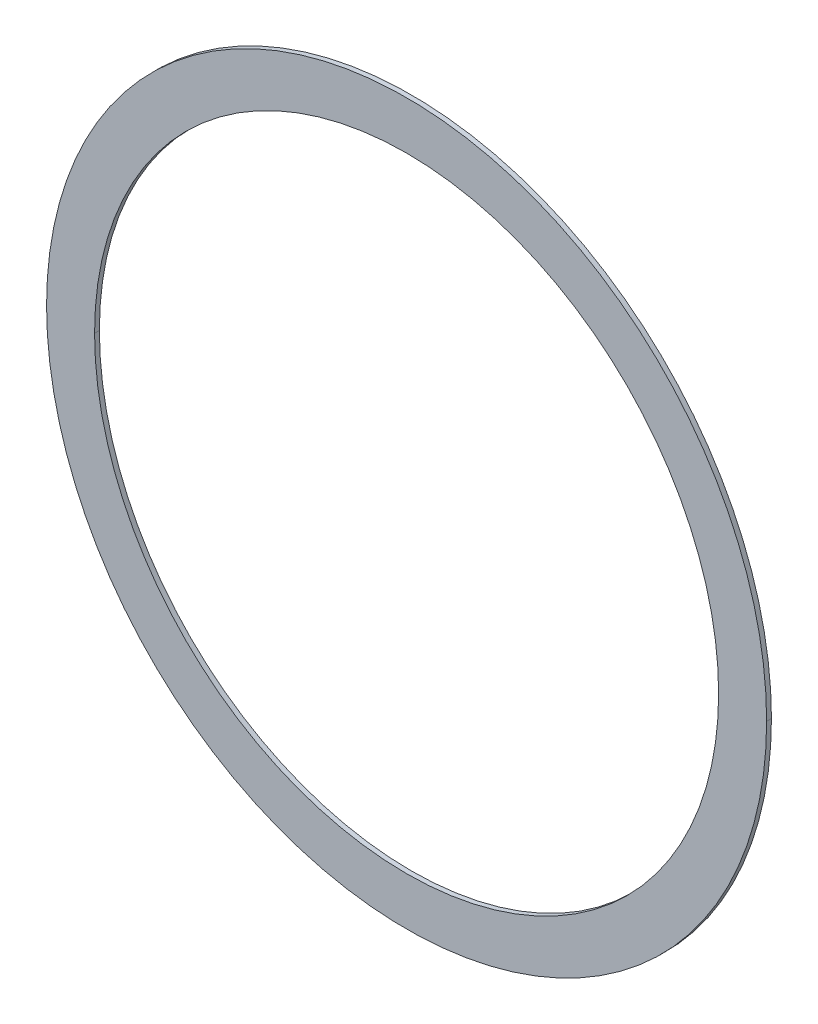
ISO-10303-21;
HEADER;
FILE_DESCRIPTION(('STEP AP214'),'2;1');
FILE_NAME('part.step','',(''),(''),'','','');
FILE_SCHEMA(('AUTOMOTIVE_DESIGN { 1 0 10303 214 1 1 1 1 }'));
ENDSEC;
DATA;
#1=APPLICATION_CONTEXT('core data for automotive mechanical design processes');
#2=APPLICATION_PROTOCOL_DEFINITION('international standard','automotive_design',2000,#1);
#3=PRODUCT_CONTEXT('',#1,'mechanical');
#4=PRODUCT('Part','Part','',(#3));
#5=PRODUCT_RELATED_PRODUCT_CATEGORY('part','',(#4));
#6=PRODUCT_DEFINITION_FORMATION('','',#4);
#7=PRODUCT_DEFINITION_CONTEXT('part definition',#1,'design');
#8=PRODUCT_DEFINITION('design','',#6,#7);
#9=PRODUCT_DEFINITION_SHAPE('','',#8);
#10=(LENGTH_UNIT() NAMED_UNIT(*) SI_UNIT(.MILLI.,.METRE.));
#11=(NAMED_UNIT(*) PLANE_ANGLE_UNIT() SI_UNIT($,.RADIAN.));
#12=(NAMED_UNIT(*) SI_UNIT($,.STERADIAN.) SOLID_ANGLE_UNIT());
#13=UNCERTAINTY_MEASURE_WITH_UNIT(LENGTH_MEASURE(1.E-05),#10,'distance_accuracy_value','');
#14=(GEOMETRIC_REPRESENTATION_CONTEXT(3) GLOBAL_UNCERTAINTY_ASSIGNED_CONTEXT((#13)) GLOBAL_UNIT_ASSIGNED_CONTEXT((#10,
#11,#12)) REPRESENTATION_CONTEXT('',''));
#15=CARTESIAN_POINT('',(0.,0.,0.));
#16=DIRECTION('',(0.,0.,1.));
#17=DIRECTION('',(1.,0.,0.));
#18=AXIS2_PLACEMENT_3D('',#15,#16,#17);
#19=CARTESIAN_POINT('',(0.,0.,-0.005));
#20=DIRECTION('',(0.,0.,1.));
#21=DIRECTION('',(1.,0.,0.));
#22=AXIS2_PLACEMENT_3D('',#19,#20,#21);
#23=CYLINDRICAL_SURFACE('',#22,0.75);
#24=CARTESIAN_POINT('',(0.,0.,-0.005));
#25=DIRECTION('',(0.,0.,1.));
#26=DIRECTION('',(1.,0.,0.));
#27=AXIS2_PLACEMENT_3D('',#24,#25,#26);
#28=CIRCLE('',#27,0.75);
#29=CARTESIAN_POINT('',(0.75,0.,-0.005));
#30=VERTEX_POINT('',#29);
#31=CARTESIAN_POINT('',(-0.75,0.,-0.005));
#32=VERTEX_POINT('',#31);
#33=EDGE_CURVE('E11',#30,#32,#28,.T.);
#34=ORIENTED_EDGE('',*,*,#33,.T.);
#35=DIRECTION('',(0.,0.,1.));
#36=VECTOR('',#35,1.);
#37=CARTESIAN_POINT('',(-0.75,0.,-0.005));
#38=LINE('',#37,#36);
#39=CARTESIAN_POINT('',(-0.75,0.,0.005));
#40=VERTEX_POINT('',#39);
#41=EDGE_CURVE('E24',#32,#40,#38,.T.);
#42=ORIENTED_EDGE('',*,*,#41,.T.);
#43=CARTESIAN_POINT('',(0.,0.,0.005));
#44=DIRECTION('',(0.,0.,1.));
#45=DIRECTION('',(1.,0.,0.));
#46=AXIS2_PLACEMENT_3D('',#43,#44,#45);
#47=CIRCLE('',#46,0.75);
#48=CARTESIAN_POINT('',(0.75,0.,0.005));
#49=VERTEX_POINT('',#48);
#50=EDGE_CURVE('E86',#49,#40,#47,.T.);
#51=ORIENTED_EDGE('',*,*,#50,.F.);
#52=DIRECTION('',(0.,0.,1.));
#53=VECTOR('',#52,1.);
#54=CARTESIAN_POINT('',(0.75,0.,-0.005));
#55=LINE('',#54,#53);
#56=EDGE_CURVE('E83',#30,#49,#55,.T.);
#57=ORIENTED_EDGE('',*,*,#56,.F.);
#58=EDGE_LOOP('',(#34,#42,#51,#57));
#59=FACE_BOUND('',#58,.T.);
#60=ADVANCED_FACE('F17',(#59),#23,.T.);
#61=CARTESIAN_POINT('',(0.,0.,-0.005));
#62=DIRECTION('',(0.,0.,1.));
#63=DIRECTION('',(1.,0.,0.));
#64=AXIS2_PLACEMENT_3D('',#61,#62,#63);
#65=CYLINDRICAL_SURFACE('',#64,0.65);
#66=CARTESIAN_POINT('',(0.,0.,-0.005));
#67=DIRECTION('',(0.,0.,1.));
#68=DIRECTION('',(1.,0.,0.));
#69=AXIS2_PLACEMENT_3D('',#66,#67,#68);
#70=CIRCLE('',#69,0.65);
#71=CARTESIAN_POINT('',(-0.65,0.,-0.005));
#72=VERTEX_POINT('',#71);
#73=CARTESIAN_POINT('',(0.65,0.,-0.005));
#74=VERTEX_POINT('',#73);
#75=EDGE_CURVE('E81',#72,#74,#70,.T.);
#76=ORIENTED_EDGE('',*,*,#75,.F.);
#77=DIRECTION('',(0.,0.,1.));
#78=VECTOR('',#77,1.);
#79=CARTESIAN_POINT('',(-0.65,0.,-0.005));
#80=LINE('',#79,#78);
#81=CARTESIAN_POINT('',(-0.65,0.,0.005));
#82=VERTEX_POINT('',#81);
#83=EDGE_CURVE('E67',#72,#82,#80,.T.);
#84=ORIENTED_EDGE('',*,*,#83,.T.);
#85=CARTESIAN_POINT('',(0.,0.,0.005));
#86=DIRECTION('',(0.,0.,1.));
#87=DIRECTION('',(1.,0.,0.));
#88=AXIS2_PLACEMENT_3D('',#85,#86,#87);
#89=CIRCLE('',#88,0.65);
#90=CARTESIAN_POINT('',(0.65,0.,0.005));
#91=VERTEX_POINT('',#90);
#92=EDGE_CURVE('E63',#82,#91,#89,.T.);
#93=ORIENTED_EDGE('',*,*,#92,.T.);
#94=DIRECTION('',(0.,0.,1.));
#95=VECTOR('',#94,1.);
#96=CARTESIAN_POINT('',(0.65,0.,-0.005));
#97=LINE('',#96,#95);
#98=EDGE_CURVE('E53',#74,#91,#97,.T.);
#99=ORIENTED_EDGE('',*,*,#98,.F.);
#100=EDGE_LOOP('',(#76,#84,#93,#99));
#101=FACE_BOUND('',#100,.T.);
#102=ADVANCED_FACE('F66',(#101),#65,.F.);
#103=CARTESIAN_POINT('',(0.,0.,-0.005));
#104=DIRECTION('',(0.,0.,1.));
#105=DIRECTION('',(1.,0.,0.));
#106=AXIS2_PLACEMENT_3D('',#103,#104,#105);
#107=CYLINDRICAL_SURFACE('',#106,0.65);
#108=ORIENTED_EDGE('',*,*,#83,.F.);
#109=CARTESIAN_POINT('',(0.,0.,-0.005));
#110=DIRECTION('',(0.,0.,1.));
#111=DIRECTION('',(1.,0.,0.));
#112=AXIS2_PLACEMENT_3D('',#109,#110,#111);
#113=CIRCLE('',#112,0.65);
#114=EDGE_CURVE('E59',#74,#72,#113,.T.);
#115=ORIENTED_EDGE('',*,*,#114,.F.);
#116=ORIENTED_EDGE('',*,*,#98,.T.);
#117=CARTESIAN_POINT('',(0.,0.,0.005));
#118=DIRECTION('',(0.,0.,1.));
#119=DIRECTION('',(1.,0.,0.));
#120=AXIS2_PLACEMENT_3D('',#117,#118,#119);
#121=CIRCLE('',#120,0.65);
#122=EDGE_CURVE('E57',#91,#82,#121,.T.);
#123=ORIENTED_EDGE('',*,*,#122,.T.);
#124=EDGE_LOOP('',(#108,#115,#116,#123));
#125=FACE_BOUND('',#124,.T.);
#126=ADVANCED_FACE('F55',(#125),#107,.F.);
#127=CARTESIAN_POINT('',(0.,0.,-0.005));
#128=DIRECTION('',(0.,0.,1.));
#129=DIRECTION('',(1.,0.,0.));
#130=AXIS2_PLACEMENT_3D('',#127,#128,#129);
#131=CYLINDRICAL_SURFACE('',#130,0.75);
#132=ORIENTED_EDGE('',*,*,#41,.F.);
#133=CARTESIAN_POINT('',(0.,0.,-0.005));
#134=DIRECTION('',(0.,0.,1.));
#135=DIRECTION('',(1.,0.,0.));
#136=AXIS2_PLACEMENT_3D('',#133,#134,#135);
#137=CIRCLE('',#136,0.75);
#138=EDGE_CURVE('E72',#32,#30,#137,.T.);
#139=ORIENTED_EDGE('',*,*,#138,.T.);
#140=ORIENTED_EDGE('',*,*,#56,.T.);
#141=CARTESIAN_POINT('',(0.,0.,0.005));
#142=DIRECTION('',(0.,0.,1.));
#143=DIRECTION('',(1.,0.,0.));
#144=AXIS2_PLACEMENT_3D('',#141,#142,#143);
#145=CIRCLE('',#144,0.75);
#146=EDGE_CURVE('E76',#40,#49,#145,.T.);
#147=ORIENTED_EDGE('',*,*,#146,.F.);
#148=EDGE_LOOP('',(#132,#139,#140,#147));
#149=FACE_BOUND('',#148,.T.);
#150=ADVANCED_FACE('F91',(#149),#131,.T.);
#151=CARTESIAN_POINT('',(0.,0.,-0.005));
#152=DIRECTION('',(0.,0.,1.));
#153=DIRECTION('',(1.,0.,0.));
#154=AXIS2_PLACEMENT_3D('',#151,#152,#153);
#155=PLANE('',#154);
#156=ORIENTED_EDGE('',*,*,#114,.T.);
#157=ORIENTED_EDGE('',*,*,#75,.T.);
#158=EDGE_LOOP('',(#156,#157));
#159=FACE_BOUND('',#158,.T.);
#160=ORIENTED_EDGE('',*,*,#33,.F.);
#161=ORIENTED_EDGE('',*,*,#138,.F.);
#162=EDGE_LOOP('',(#160,#161));
#163=FACE_BOUND('',#162,.T.);
#164=ADVANCED_FACE('F92',(#159,#163),#155,.F.);
#165=CARTESIAN_POINT('',(0.,0.,0.005));
#166=DIRECTION('',(0.,0.,1.));
#167=DIRECTION('',(1.,0.,0.));
#168=AXIS2_PLACEMENT_3D('',#165,#166,#167);
#169=PLANE('',#168);
#170=ORIENTED_EDGE('',*,*,#122,.F.);
#171=ORIENTED_EDGE('',*,*,#92,.F.);
#172=EDGE_LOOP('',(#170,#171));
#173=FACE_BOUND('',#172,.T.);
#174=ORIENTED_EDGE('',*,*,#50,.T.);
#175=ORIENTED_EDGE('',*,*,#146,.T.);
#176=EDGE_LOOP('',(#174,#175));
#177=FACE_BOUND('',#176,.T.);
#178=ADVANCED_FACE('F70',(#173,#177),#169,.T.);
#179=CLOSED_SHELL('',(#60,#102,#126,#150,#164,#178));
#180=MANIFOLD_SOLID_BREP('B1',#179);
#181=ADVANCED_BREP_SHAPE_REPRESENTATION('',(#18,#180),#14);
#182=SHAPE_DEFINITION_REPRESENTATION(#9,#181);
ENDSEC;
END-ISO-10303-21;
